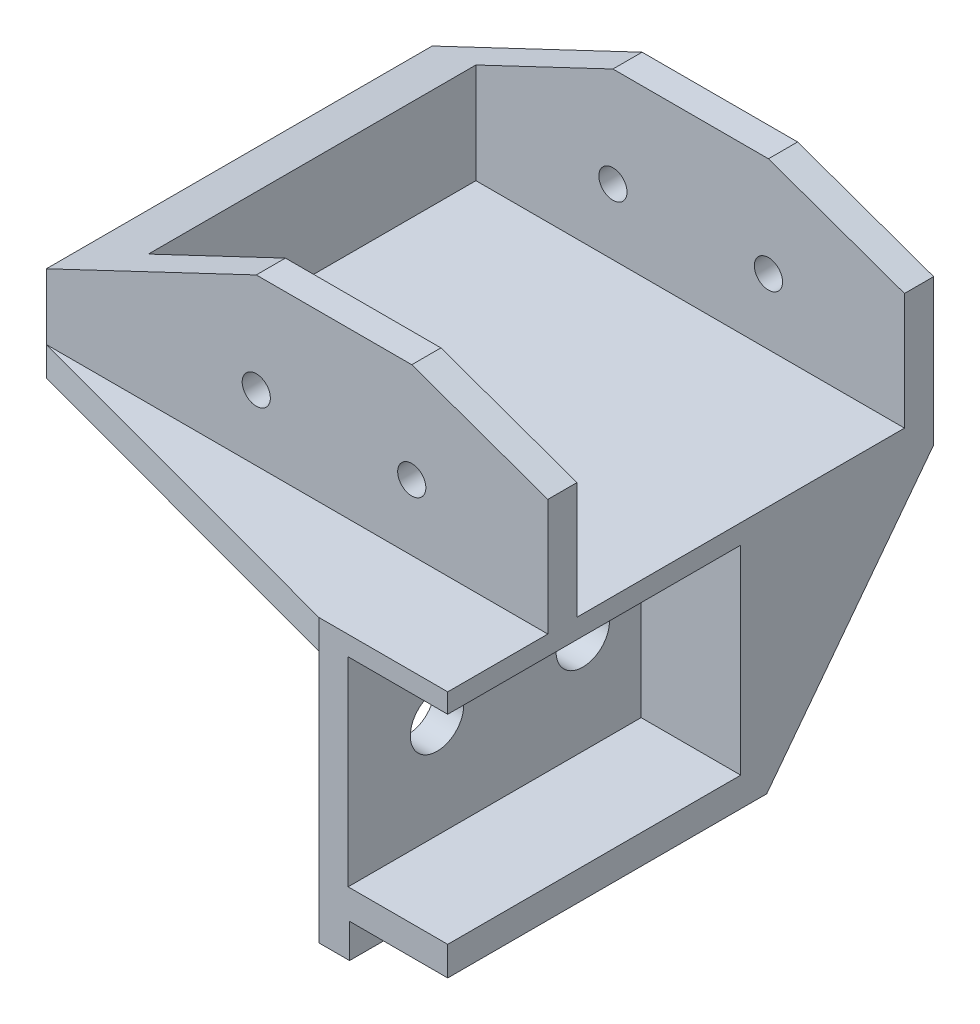
ISO-10303-21;
HEADER;
FILE_DESCRIPTION(('STEP AP214'),'2;1');
FILE_NAME('part.step','',(''),(''),'','','');
FILE_SCHEMA(('AUTOMOTIVE_DESIGN { 1 0 10303 214 1 1 1 1 }'));
ENDSEC;
DATA;
#1=APPLICATION_CONTEXT('core data for automotive mechanical design processes');
#2=APPLICATION_PROTOCOL_DEFINITION('international standard','automotive_design',2000,#1);
#3=PRODUCT_CONTEXT('',#1,'mechanical');
#4=PRODUCT('Part','Part','',(#3));
#5=PRODUCT_RELATED_PRODUCT_CATEGORY('part','',(#4));
#6=PRODUCT_DEFINITION_FORMATION('','',#4);
#7=PRODUCT_DEFINITION_CONTEXT('part definition',#1,'design');
#8=PRODUCT_DEFINITION('design','',#6,#7);
#9=PRODUCT_DEFINITION_SHAPE('','',#8);
#10=(LENGTH_UNIT() NAMED_UNIT(*) SI_UNIT(.MILLI.,.METRE.));
#11=(NAMED_UNIT(*) PLANE_ANGLE_UNIT() SI_UNIT($,.RADIAN.));
#12=(NAMED_UNIT(*) SI_UNIT($,.STERADIAN.) SOLID_ANGLE_UNIT());
#13=UNCERTAINTY_MEASURE_WITH_UNIT(LENGTH_MEASURE(1.E-05),#10,'distance_accuracy_value','');
#14=(GEOMETRIC_REPRESENTATION_CONTEXT(3) GLOBAL_UNCERTAINTY_ASSIGNED_CONTEXT((#13)) GLOBAL_UNIT_ASSIGNED_CONTEXT((#10,
#11,#12)) REPRESENTATION_CONTEXT('',''));
#15=CARTESIAN_POINT('',(0.,0.,0.));
#16=DIRECTION('',(0.,0.,1.));
#17=DIRECTION('',(1.,0.,0.));
#18=AXIS2_PLACEMENT_3D('',#15,#16,#17);
#19=CARTESIAN_POINT('',(0.,0.,39.7));
#20=DIRECTION('',(0.,0.,-1.));
#21=DIRECTION('',(-1.,0.,0.));
#22=AXIS2_PLACEMENT_3D('',#19,#20,#21);
#23=PLANE('',#22);
#24=CARTESIAN_POINT('',(-81.6,9.74999999999999,39.7));
#25=DIRECTION('',(0.,0.,-1.));
#26=DIRECTION('',(-1.,0.,0.));
#27=AXIS2_PLACEMENT_3D('',#24,#25,#26);
#28=CIRCLE('',#27,1.44999999999999);
#29=CARTESIAN_POINT('',(-83.05,9.74999999999999,39.7));
#30=VERTEX_POINT('',#29);
#31=EDGE_CURVE('E451',#30,#30,#28,.T.);
#32=ORIENTED_EDGE('',*,*,#31,.T.);
#33=EDGE_LOOP('',(#32));
#34=FACE_BOUND('',#33,.T.);
#35=CARTESIAN_POINT('',(-65.6,9.74999999999999,39.7));
#36=DIRECTION('',(0.,0.,-1.));
#37=DIRECTION('',(-1.,0.,0.));
#38=AXIS2_PLACEMENT_3D('',#35,#36,#37);
#39=CIRCLE('',#38,1.44999999999999);
#40=CARTESIAN_POINT('',(-67.05,9.74999999999999,39.7));
#41=VERTEX_POINT('',#40);
#42=EDGE_CURVE('E437',#41,#41,#39,.T.);
#43=ORIENTED_EDGE('',*,*,#42,.T.);
#44=EDGE_LOOP('',(#43));
#45=FACE_BOUND('',#44,.T.);
#46=DIRECTION('',(-1.,0.,0.));
#47=VECTOR('',#46,1.);
#48=CARTESIAN_POINT('',(0.,3.,39.7));
#49=LINE('',#48,#47);
#50=CARTESIAN_POINT('',(-51.6,2.99999999999999,39.7));
#51=VERTEX_POINT('',#50);
#52=CARTESIAN_POINT('',(-103.2,3.,39.7));
#53=VERTEX_POINT('',#52);
#54=EDGE_CURVE('E301',#51,#53,#49,.T.);
#55=ORIENTED_EDGE('',*,*,#54,.F.);
#56=DIRECTION('',(0.,1.,0.));
#57=VECTOR('',#56,1.);
#58=CARTESIAN_POINT('',(-51.6,0.,39.7));
#59=LINE('',#58,#57);
#60=CARTESIAN_POINT('',(-51.6,15.,39.7));
#61=VERTEX_POINT('',#60);
#62=EDGE_CURVE('E517',#51,#61,#59,.T.);
#63=ORIENTED_EDGE('',*,*,#62,.T.);
#64=DIRECTION('',(0.941741911594838,-0.336336396998156,0.));
#65=VECTOR('',#64,1.);
#66=CARTESIAN_POINT('',(-1.08597285067873,-3.04072398190046,39.7));
#67=LINE('',#66,#65);
#68=CARTESIAN_POINT('',(-65.6,20.,39.7));
#69=VERTEX_POINT('',#68);
#70=EDGE_CURVE('E405',#69,#61,#67,.T.);
#71=ORIENTED_EDGE('',*,*,#70,.F.);
#72=DIRECTION('',(-1.,0.,0.));
#73=VECTOR('',#72,1.);
#74=CARTESIAN_POINT('',(-103.2,20.,39.7));
#75=LINE('',#74,#73);
#76=CARTESIAN_POINT('',(-81.6,20.,39.7));
#77=VERTEX_POINT('',#76);
#78=EDGE_CURVE('E335',#69,#77,#75,.T.);
#79=ORIENTED_EDGE('',*,*,#78,.T.);
#80=DIRECTION('',(0.903439539264527,0.428715522104694,0.));
#81=VECTOR('',#80,1.);
#82=CARTESIAN_POINT('',(-22.7442061850259,47.9292540094205,39.7));
#83=LINE('',#82,#81);
#84=CARTESIAN_POINT('',(-103.2,9.75000000000001,39.7));
#85=VERTEX_POINT('',#84);
#86=EDGE_CURVE('E375',#85,#77,#83,.T.);
#87=ORIENTED_EDGE('',*,*,#86,.F.);
#88=DIRECTION('',(0.,-1.,0.));
#89=VECTOR('',#88,1.);
#90=CARTESIAN_POINT('',(-103.2,0.,39.7));
#91=LINE('',#90,#89);
#92=EDGE_CURVE('E339',#85,#53,#91,.T.);
#93=ORIENTED_EDGE('',*,*,#92,.T.);
#94=EDGE_LOOP('',(#55,#63,#71,#79,#87,#93));
#95=FACE_BOUND('',#94,.T.);
#96=ADVANCED_FACE('F47',(#34,#45,#95),#23,.F.);
#97=CARTESIAN_POINT('',(-103.2,20.,39.7));
#98=DIRECTION('',(0.,-1.,0.));
#99=DIRECTION('',(1.,0.,0.));
#100=AXIS2_PLACEMENT_3D('',#97,#98,#99);
#101=PLANE('',#100);
#102=DIRECTION('',(0.,0.,-1.));
#103=VECTOR('',#102,1.);
#104=CARTESIAN_POINT('',(-81.6,20.,50.));
#105=LINE('',#104,#103);
#106=CARTESIAN_POINT('',(-81.6,20.,36.7));
#107=VERTEX_POINT('',#106);
#108=EDGE_CURVE('E70',#77,#107,#105,.T.);
#109=ORIENTED_EDGE('',*,*,#108,.F.);
#110=ORIENTED_EDGE('',*,*,#78,.F.);
#111=DIRECTION('',(0.,0.,-1.));
#112=VECTOR('',#111,1.);
#113=CARTESIAN_POINT('',(-65.6,20.,50.));
#114=LINE('',#113,#112);
#115=CARTESIAN_POINT('',(-65.6,20.,36.7));
#116=VERTEX_POINT('',#115);
#117=EDGE_CURVE('E383',#69,#116,#114,.T.);
#118=ORIENTED_EDGE('',*,*,#117,.T.);
#119=DIRECTION('',(1.,0.,0.));
#120=VECTOR('',#119,1.);
#121=CARTESIAN_POINT('',(-95.7,20.,36.7));
#122=LINE('',#121,#120);
#123=EDGE_CURVE('E308',#107,#116,#122,.T.);
#124=ORIENTED_EDGE('',*,*,#123,.F.);
#125=EDGE_LOOP('',(#109,#110,#118,#124));
#126=FACE_BOUND('',#125,.T.);
#127=ADVANCED_FACE('F49',(#126),#101,.F.);
#128=CARTESIAN_POINT('',(-81.6,20.,3.));
#129=VERTEX_POINT('',#128);
#130=CARTESIAN_POINT('',(-81.6,20.,0.));
#131=VERTEX_POINT('',#130);
#132=EDGE_CURVE('E526',#129,#131,#105,.T.);
#133=ORIENTED_EDGE('',*,*,#132,.F.);
#134=DIRECTION('',(-1.,0.,0.));
#135=VECTOR('',#134,1.);
#136=CARTESIAN_POINT('',(-95.7,20.,3.));
#137=LINE('',#136,#135);
#138=CARTESIAN_POINT('',(-65.6000000000001,20.,3.));
#139=VERTEX_POINT('',#138);
#140=EDGE_CURVE('E321',#139,#129,#137,.T.);
#141=ORIENTED_EDGE('',*,*,#140,.F.);
#142=CARTESIAN_POINT('',(-65.6,20.,0.));
#143=VERTEX_POINT('',#142);
#144=EDGE_CURVE('E63',#139,#143,#114,.T.);
#145=ORIENTED_EDGE('',*,*,#144,.T.);
#146=DIRECTION('',(-1.,0.,0.));
#147=VECTOR('',#146,1.);
#148=CARTESIAN_POINT('',(-103.2,20.,0.));
#149=LINE('',#148,#147);
#150=EDGE_CURVE('E334',#143,#131,#149,.T.);
#151=ORIENTED_EDGE('',*,*,#150,.T.);
#152=EDGE_LOOP('',(#133,#141,#145,#151));
#153=FACE_BOUND('',#152,.T.);
#154=ADVANCED_FACE('F547',(#153),#101,.F.);
#155=CARTESIAN_POINT('',(-103.2,0.,39.7));
#156=DIRECTION('',(1.,0.,0.));
#157=DIRECTION('',(0.,0.,-1.));
#158=AXIS2_PLACEMENT_3D('',#155,#156,#157);
#159=PLANE('',#158);
#160=DIRECTION('',(0.,0.,-1.));
#161=VECTOR('',#160,1.);
#162=CARTESIAN_POINT('',(-103.2,9.75000000000001,50.));
#163=LINE('',#162,#161);
#164=CARTESIAN_POINT('',(-103.2,9.75000000000001,0.));
#165=VERTEX_POINT('',#164);
#166=EDGE_CURVE('E525',#85,#165,#163,.T.);
#167=ORIENTED_EDGE('',*,*,#166,.T.);
#168=DIRECTION('',(0.,-1.,0.));
#169=VECTOR('',#168,1.);
#170=CARTESIAN_POINT('',(-103.2,0.,0.));
#171=LINE('',#170,#169);
#172=CARTESIAN_POINT('',(-103.2,0.,0.));
#173=VERTEX_POINT('',#172);
#174=EDGE_CURVE('E348',#165,#173,#171,.T.);
#175=ORIENTED_EDGE('',*,*,#174,.T.);
#176=DIRECTION('',(0.,0.,-1.));
#177=VECTOR('',#176,1.);
#178=CARTESIAN_POINT('',(-103.2,0.,39.7));
#179=LINE('',#178,#177);
#180=CARTESIAN_POINT('',(-103.2,0.,39.7));
#181=VERTEX_POINT('',#180);
#182=EDGE_CURVE('E344',#181,#173,#179,.T.);
#183=ORIENTED_EDGE('',*,*,#182,.F.);
#184=DIRECTION('',(0.,-1.,0.));
#185=VECTOR('',#184,1.);
#186=CARTESIAN_POINT('',(-103.2,42.709098453629,39.7));
#187=LINE('',#186,#185);
#188=EDGE_CURVE('E459',#53,#181,#187,.T.);
#189=ORIENTED_EDGE('',*,*,#188,.F.);
#190=ORIENTED_EDGE('',*,*,#92,.F.);
#191=EDGE_LOOP('',(#167,#175,#183,#189,#190));
#192=FACE_BOUND('',#191,.T.);
#193=ADVANCED_FACE('F549',(#192),#159,.F.);
#194=CARTESIAN_POINT('',(0.,0.,0.));
#195=DIRECTION('',(0.,0.,-1.));
#196=DIRECTION('',(-1.,0.,0.));
#197=AXIS2_PLACEMENT_3D('',#194,#195,#196);
#198=PLANE('',#197);
#199=DIRECTION('',(0.,-1.,0.));
#200=VECTOR('',#199,1.);
#201=CARTESIAN_POINT('',(-51.6,20.,0.));
#202=LINE('',#201,#200);
#203=CARTESIAN_POINT('',(-51.6,15.,0.));
#204=VERTEX_POINT('',#203);
#205=CARTESIAN_POINT('',(-51.6,0.,0.));
#206=VERTEX_POINT('',#205);
#207=EDGE_CURVE('E202',#204,#206,#202,.T.);
#208=ORIENTED_EDGE('',*,*,#207,.T.);
#209=DIRECTION('',(1.,0.,0.));
#210=VECTOR('',#209,1.);
#211=CARTESIAN_POINT('',(-103.2,0.,0.));
#212=LINE('',#211,#210);
#213=CARTESIAN_POINT('',(-64.85,0.,0.));
#214=VERTEX_POINT('',#213);
#215=EDGE_CURVE('E218',#214,#206,#212,.T.);
#216=ORIENTED_EDGE('',*,*,#215,.F.);
#217=DIRECTION('',(1.,0.,0.));
#218=VECTOR('',#217,1.);
#219=CARTESIAN_POINT('',(0.,0.,0.));
#220=LINE('',#219,#218);
#221=EDGE_CURVE('E340',#173,#214,#220,.T.);
#222=ORIENTED_EDGE('',*,*,#221,.F.);
#223=ORIENTED_EDGE('',*,*,#174,.F.);
#224=DIRECTION('',(0.903439539264527,0.428715522104694,0.));
#225=VECTOR('',#224,1.);
#226=CARTESIAN_POINT('',(-22.7442061850259,47.9292540094205,0.));
#227=LINE('',#226,#225);
#228=EDGE_CURVE('E521',#165,#131,#227,.T.);
#229=ORIENTED_EDGE('',*,*,#228,.T.);
#230=ORIENTED_EDGE('',*,*,#150,.F.);
#231=DIRECTION('',(0.941741911594838,-0.336336396998156,0.));
#232=VECTOR('',#231,1.);
#233=CARTESIAN_POINT('',(-65.6,20.,0.));
#234=LINE('',#233,#232);
#235=EDGE_CURVE('E221',#143,#204,#234,.T.);
#236=ORIENTED_EDGE('',*,*,#235,.T.);
#237=EDGE_LOOP('',(#208,#216,#222,#223,#229,#230,#236));
#238=FACE_BOUND('',#237,.T.);
#239=CARTESIAN_POINT('',(-65.6,9.74999999999999,0.));
#240=DIRECTION('',(0.,0.,-1.));
#241=DIRECTION('',(-1.,0.,0.));
#242=AXIS2_PLACEMENT_3D('',#239,#240,#241);
#243=CIRCLE('',#242,1.475);
#244=CARTESIAN_POINT('',(-67.075,9.74999999999999,0.));
#245=VERTEX_POINT('',#244);
#246=EDGE_CURVE('E427',#245,#245,#243,.T.);
#247=ORIENTED_EDGE('',*,*,#246,.F.);
#248=EDGE_LOOP('',(#247));
#249=FACE_BOUND('',#248,.T.);
#250=CARTESIAN_POINT('',(-81.6,9.74999999999999,0.));
#251=DIRECTION('',(0.,0.,-1.));
#252=DIRECTION('',(-1.,0.,0.));
#253=AXIS2_PLACEMENT_3D('',#250,#251,#252);
#254=CIRCLE('',#253,1.475);
#255=CARTESIAN_POINT('',(-83.075,9.74999999999999,0.));
#256=VERTEX_POINT('',#255);
#257=EDGE_CURVE('E441',#256,#256,#254,.T.);
#258=ORIENTED_EDGE('',*,*,#257,.F.);
#259=EDGE_LOOP('',(#258));
#260=FACE_BOUND('',#259,.T.);
#261=ADVANCED_FACE('F215',(#238,#249,#260),#198,.T.);
#262=CARTESIAN_POINT('',(-95.7,-94.4189070049002,3.));
#263=DIRECTION('',(-1.,0.,0.));
#264=DIRECTION('',(0.,0.,1.));
#265=AXIS2_PLACEMENT_3D('',#262,#263,#264);
#266=PLANE('',#265);
#267=DIRECTION('',(0.,0.,-1.));
#268=VECTOR('',#267,1.);
#269=CARTESIAN_POINT('',(-95.7,13.3090277777778,3.));
#270=LINE('',#269,#268);
#271=CARTESIAN_POINT('',(-95.7,13.3090277777778,36.7));
#272=VERTEX_POINT('',#271);
#273=CARTESIAN_POINT('',(-95.7,13.3090277777778,3.));
#274=VERTEX_POINT('',#273);
#275=EDGE_CURVE('E398',#272,#274,#270,.T.);
#276=ORIENTED_EDGE('',*,*,#275,.F.);
#277=DIRECTION('',(0.,1.,0.));
#278=VECTOR('',#277,1.);
#279=CARTESIAN_POINT('',(-95.7,-94.4189070049002,36.7));
#280=LINE('',#279,#278);
#281=CARTESIAN_POINT('',(-95.7,2.99999999999999,36.7));
#282=VERTEX_POINT('',#281);
#283=EDGE_CURVE('E325',#282,#272,#280,.T.);
#284=ORIENTED_EDGE('',*,*,#283,.F.);
#285=DIRECTION('',(0.,0.,-1.));
#286=VECTOR('',#285,1.);
#287=CARTESIAN_POINT('',(-95.7,2.99999999999999,3.));
#288=LINE('',#287,#286);
#289=CARTESIAN_POINT('',(-95.7,2.99999999999999,3.));
#290=VERTEX_POINT('',#289);
#291=EDGE_CURVE('E313',#282,#290,#288,.T.);
#292=ORIENTED_EDGE('',*,*,#291,.T.);
#293=DIRECTION('',(0.,1.,0.));
#294=VECTOR('',#293,1.);
#295=CARTESIAN_POINT('',(-95.7,-94.4189070049002,3.));
#296=LINE('',#295,#294);
#297=EDGE_CURVE('E314',#290,#274,#296,.T.);
#298=ORIENTED_EDGE('',*,*,#297,.T.);
#299=EDGE_LOOP('',(#276,#284,#292,#298));
#300=FACE_BOUND('',#299,.T.);
#301=ADVANCED_FACE('F401',(#300),#266,.F.);
#302=CARTESIAN_POINT('',(-95.7,-94.4189070049002,3.));
#303=DIRECTION('',(0.,0.,-1.));
#304=DIRECTION('',(-1.,0.,0.));
#305=AXIS2_PLACEMENT_3D('',#302,#303,#304);
#306=PLANE('',#305);
#307=CARTESIAN_POINT('',(-81.6,9.74999999999999,3.));
#308=DIRECTION('',(0.,0.,-1.));
#309=DIRECTION('',(-1.,0.,0.));
#310=AXIS2_PLACEMENT_3D('',#307,#308,#309);
#311=CIRCLE('',#310,1.44999999999999);
#312=CARTESIAN_POINT('',(-83.05,9.74999999999999,3.));
#313=VERTEX_POINT('',#312);
#314=EDGE_CURVE('E359',#313,#313,#311,.T.);
#315=ORIENTED_EDGE('',*,*,#314,.T.);
#316=EDGE_LOOP('',(#315));
#317=FACE_BOUND('',#316,.T.);
#318=CARTESIAN_POINT('',(-65.6,9.74999999999999,3.));
#319=DIRECTION('',(0.,0.,-1.));
#320=DIRECTION('',(-1.,0.,0.));
#321=AXIS2_PLACEMENT_3D('',#318,#319,#320);
#322=CIRCLE('',#321,1.44999999999999);
#323=CARTESIAN_POINT('',(-67.05,9.74999999999999,3.));
#324=VERTEX_POINT('',#323);
#325=EDGE_CURVE('E365',#324,#324,#322,.T.);
#326=ORIENTED_EDGE('',*,*,#325,.T.);
#327=EDGE_LOOP('',(#326));
#328=FACE_BOUND('',#327,.T.);
#329=DIRECTION('',(1.,0.,0.));
#330=VECTOR('',#329,1.);
#331=CARTESIAN_POINT('',(-95.7,2.99999999999999,3.));
#332=LINE('',#331,#330);
#333=CARTESIAN_POINT('',(-51.6,2.99999999999999,3.));
#334=VERTEX_POINT('',#333);
#335=EDGE_CURVE('E309',#290,#334,#332,.T.);
#336=ORIENTED_EDGE('',*,*,#335,.T.);
#337=DIRECTION('',(0.,1.,0.));
#338=VECTOR('',#337,1.);
#339=CARTESIAN_POINT('',(-51.6,-94.4189070049002,3.));
#340=LINE('',#339,#338);
#341=CARTESIAN_POINT('',(-51.6,15.,3.));
#342=VERTEX_POINT('',#341);
#343=EDGE_CURVE('E544',#334,#342,#340,.T.);
#344=ORIENTED_EDGE('',*,*,#343,.T.);
#345=DIRECTION('',(0.941741911594838,-0.336336396998156,0.));
#346=VECTOR('',#345,1.);
#347=CARTESIAN_POINT('',(-56.0537398627013,16.5906213795362,3.));
#348=LINE('',#347,#346);
#349=EDGE_CURVE('E410',#139,#342,#348,.T.);
#350=ORIENTED_EDGE('',*,*,#349,.F.);
#351=ORIENTED_EDGE('',*,*,#140,.T.);
#352=DIRECTION('',(0.903439539264527,0.428715522104694,0.));
#353=VECTOR('',#352,1.);
#354=CARTESIAN_POINT('',(-137.425027900205,-6.4910433322731,3.00000000000001));
#355=LINE('',#354,#353);
#356=EDGE_CURVE('E404',#274,#129,#355,.T.);
#357=ORIENTED_EDGE('',*,*,#356,.F.);
#358=ORIENTED_EDGE('',*,*,#297,.F.);
#359=EDGE_LOOP('',(#336,#344,#350,#351,#357,#358));
#360=FACE_BOUND('',#359,.T.);
#361=ADVANCED_FACE('F543',(#317,#328,#360),#306,.F.);
#362=CARTESIAN_POINT('',(-95.7,-94.4189070049002,36.7));
#363=DIRECTION('',(0.,0.,1.));
#364=DIRECTION('',(1.,0.,0.));
#365=AXIS2_PLACEMENT_3D('',#362,#363,#364);
#366=PLANE('',#365);
#367=CARTESIAN_POINT('',(-81.6,9.74999999999999,36.7));
#368=DIRECTION('',(0.,0.,1.));
#369=DIRECTION('',(1.,0.,0.));
#370=AXIS2_PLACEMENT_3D('',#367,#368,#369);
#371=CIRCLE('',#370,1.44999999999999);
#372=CARTESIAN_POINT('',(-80.15,9.74999999999999,36.7));
#373=VERTEX_POINT('',#372);
#374=EDGE_CURVE('E363',#373,#373,#371,.T.);
#375=ORIENTED_EDGE('',*,*,#374,.T.);
#376=EDGE_LOOP('',(#375));
#377=FACE_BOUND('',#376,.T.);
#378=CARTESIAN_POINT('',(-65.6,9.74999999999999,36.7));
#379=DIRECTION('',(0.,0.,1.));
#380=DIRECTION('',(1.,0.,0.));
#381=AXIS2_PLACEMENT_3D('',#378,#379,#380);
#382=CIRCLE('',#381,1.44999999999999);
#383=CARTESIAN_POINT('',(-64.15,9.74999999999999,36.7));
#384=VERTEX_POINT('',#383);
#385=EDGE_CURVE('E369',#384,#384,#382,.T.);
#386=ORIENTED_EDGE('',*,*,#385,.T.);
#387=EDGE_LOOP('',(#386));
#388=FACE_BOUND('',#387,.T.);
#389=DIRECTION('',(-0.941741911594838,0.336336396998156,0.));
#390=VECTOR('',#389,1.);
#391=CARTESIAN_POINT('',(-56.0537398627013,16.5906213795362,36.7));
#392=LINE('',#391,#390);
#393=CARTESIAN_POINT('',(-51.6,15.,36.7));
#394=VERTEX_POINT('',#393);
#395=EDGE_CURVE('E56',#394,#116,#392,.T.);
#396=ORIENTED_EDGE('',*,*,#395,.F.);
#397=DIRECTION('',(0.,-1.,0.));
#398=VECTOR('',#397,1.);
#399=CARTESIAN_POINT('',(-51.6,-94.4189070049002,36.7));
#400=LINE('',#399,#398);
#401=CARTESIAN_POINT('',(-51.6,2.99999999999999,36.7));
#402=VERTEX_POINT('',#401);
#403=EDGE_CURVE('E210',#394,#402,#400,.T.);
#404=ORIENTED_EDGE('',*,*,#403,.T.);
#405=DIRECTION('',(-1.,0.,0.));
#406=VECTOR('',#405,1.);
#407=CARTESIAN_POINT('',(-95.7,2.99999999999999,36.7));
#408=LINE('',#407,#406);
#409=EDGE_CURVE('E317',#402,#282,#408,.T.);
#410=ORIENTED_EDGE('',*,*,#409,.T.);
#411=ORIENTED_EDGE('',*,*,#283,.T.);
#412=DIRECTION('',(-0.903439539264527,-0.428715522104694,0.));
#413=VECTOR('',#412,1.);
#414=CARTESIAN_POINT('',(-137.425027900205,-6.4910433322731,36.7));
#415=LINE('',#414,#413);
#416=EDGE_CURVE('E12',#107,#272,#415,.T.);
#417=ORIENTED_EDGE('',*,*,#416,.F.);
#418=ORIENTED_EDGE('',*,*,#123,.T.);
#419=EDGE_LOOP('',(#396,#404,#410,#411,#417,#418));
#420=FACE_BOUND('',#419,.T.);
#421=ADVANCED_FACE('F394',(#377,#388,#420),#366,.F.);
#422=CARTESIAN_POINT('',(0.,-26.,0.));
#423=DIRECTION('',(0.,-1.,0.));
#424=DIRECTION('',(1.,0.,0.));
#425=AXIS2_PLACEMENT_3D('',#422,#423,#424);
#426=PLANE('',#425);
#427=DIRECTION('',(1.,0.,0.));
#428=VECTOR('',#427,1.);
#429=CARTESIAN_POINT('',(-103.2,-26.,19.85));
#430=LINE('',#429,#428);
#431=CARTESIAN_POINT('',(-64.85,-26.,19.85));
#432=VERTEX_POINT('',#431);
#433=CARTESIAN_POINT('',(-61.7,-26.,19.85));
#434=VERTEX_POINT('',#433);
#435=EDGE_CURVE('E230',#432,#434,#430,.T.);
#436=ORIENTED_EDGE('',*,*,#435,.T.);
#437=DIRECTION('',(0.,0.,-1.));
#438=VECTOR('',#437,1.);
#439=CARTESIAN_POINT('',(-61.7,-26.,0.));
#440=LINE('',#439,#438);
#441=CARTESIAN_POINT('',(-61.7,-26.,50.));
#442=VERTEX_POINT('',#441);
#443=EDGE_CURVE('E244',#442,#434,#440,.T.);
#444=ORIENTED_EDGE('',*,*,#443,.F.);
#445=DIRECTION('',(-1.,0.,0.));
#446=VECTOR('',#445,1.);
#447=CARTESIAN_POINT('',(-64.85,-26.,50.));
#448=LINE('',#447,#446);
#449=CARTESIAN_POINT('',(-64.85,-26.,50.));
#450=VERTEX_POINT('',#449);
#451=EDGE_CURVE('E288',#442,#450,#448,.T.);
#452=ORIENTED_EDGE('',*,*,#451,.T.);
#453=DIRECTION('',(0.,0.,-1.));
#454=VECTOR('',#453,1.);
#455=CARTESIAN_POINT('',(-64.85,-26.,0.));
#456=LINE('',#455,#454);
#457=EDGE_CURVE('E291',#450,#432,#456,.T.);
#458=ORIENTED_EDGE('',*,*,#457,.T.);
#459=EDGE_LOOP('',(#436,#444,#452,#458));
#460=FACE_BOUND('',#459,.T.);
#461=ADVANCED_FACE('F487',(#460),#426,.T.);
#462=CARTESIAN_POINT('',(0.,0.,39.7));
#463=DIRECTION('',(0.,1.,0.));
#464=DIRECTION('',(-1.,0.,0.));
#465=AXIS2_PLACEMENT_3D('',#462,#463,#464);
#466=PLANE('',#465);
#467=DIRECTION('',(0.,0.,-1.));
#468=VECTOR('',#467,1.);
#469=CARTESIAN_POINT('',(-64.85,0.,39.7));
#470=LINE('',#469,#468);
#471=CARTESIAN_POINT('',(-64.85,0.,50.));
#472=VERTEX_POINT('',#471);
#473=EDGE_CURVE('E304',#472,#214,#470,.T.);
#474=ORIENTED_EDGE('',*,*,#473,.F.);
#475=DIRECTION('',(-0.965773626031422,0.,-0.259386397604267));
#476=VECTOR('',#475,1.);
#477=CARTESIAN_POINT('',(-64.85,0.,50.));
#478=LINE('',#477,#476);
#479=EDGE_CURVE('E237',#472,#181,#478,.T.);
#480=ORIENTED_EDGE('',*,*,#479,.T.);
#481=ORIENTED_EDGE('',*,*,#182,.T.);
#482=ORIENTED_EDGE('',*,*,#221,.T.);
#483=EDGE_LOOP('',(#474,#480,#481,#482));
#484=FACE_BOUND('',#483,.T.);
#485=ADVANCED_FACE('F475',(#484),#466,.F.);
#486=CARTESIAN_POINT('',(0.,3.,39.7));
#487=DIRECTION('',(0.,1.,0.));
#488=DIRECTION('',(-1.,0.,0.));
#489=AXIS2_PLACEMENT_3D('',#486,#487,#488);
#490=PLANE('',#489);
#491=DIRECTION('',(0.,0.,1.));
#492=VECTOR('',#491,1.);
#493=CARTESIAN_POINT('',(-51.6,2.99999999999999,39.7));
#494=LINE('',#493,#492);
#495=EDGE_CURVE('E861',#334,#402,#494,.T.);
#496=ORIENTED_EDGE('',*,*,#495,.F.);
#497=ORIENTED_EDGE('',*,*,#335,.F.);
#498=ORIENTED_EDGE('',*,*,#291,.F.);
#499=ORIENTED_EDGE('',*,*,#409,.F.);
#500=EDGE_LOOP('',(#496,#497,#498,#499));
#501=FACE_BOUND('',#500,.T.);
#502=ADVANCED_FACE('F564',(#501),#490,.T.);
#503=CARTESIAN_POINT('',(-64.85,-26.,0.));
#504=DIRECTION('',(1.,0.,0.));
#505=DIRECTION('',(0.,1.,0.));
#506=AXIS2_PLACEMENT_3D('',#503,#504,#505);
#507=PLANE('',#506);
#508=CARTESIAN_POINT('',(-64.85,-9.24999999999995,25.85));
#509=DIRECTION('',(1.,0.,0.));
#510=DIRECTION('',(0.,1.,0.));
#511=AXIS2_PLACEMENT_3D('',#508,#509,#510);
#512=CIRCLE('',#511,2.74999999999999);
#513=CARTESIAN_POINT('',(-64.85,-6.49999999999996,25.85));
#514=VERTEX_POINT('',#513);
#515=EDGE_CURVE('E374',#514,#514,#512,.T.);
#516=ORIENTED_EDGE('',*,*,#515,.T.);
#517=EDGE_LOOP('',(#516));
#518=FACE_BOUND('',#517,.T.);
#519=CARTESIAN_POINT('',(-64.85,-9.24999999999995,40.85));
#520=DIRECTION('',(1.,0.,0.));
#521=DIRECTION('',(0.,1.,0.));
#522=AXIS2_PLACEMENT_3D('',#519,#520,#521);
#523=CIRCLE('',#522,2.74999999999999);
#524=CARTESIAN_POINT('',(-64.85,-6.49999999999996,40.85));
#525=VERTEX_POINT('',#524);
#526=EDGE_CURVE('E419',#525,#525,#523,.T.);
#527=ORIENTED_EDGE('',*,*,#526,.T.);
#528=EDGE_LOOP('',(#527));
#529=FACE_BOUND('',#528,.T.);
#530=DIRECTION('',(0.,1.,0.));
#531=VECTOR('',#530,1.);
#532=CARTESIAN_POINT('',(-64.85,-26.,50.));
#533=LINE('',#532,#531);
#534=EDGE_CURVE('E295',#450,#472,#533,.T.);
#535=ORIENTED_EDGE('',*,*,#534,.T.);
#536=ORIENTED_EDGE('',*,*,#473,.T.);
#537=DIRECTION('',(0.,-0.794834835806078,0.606825826567332));
#538=VECTOR('',#537,1.);
#539=CARTESIAN_POINT('',(-64.85,-16.4258228214827,12.5404839617859));
#540=LINE('',#539,#538);
#541=EDGE_CURVE('E227',#214,#432,#540,.T.);
#542=ORIENTED_EDGE('',*,*,#541,.T.);
#543=ORIENTED_EDGE('',*,*,#457,.F.);
#544=EDGE_LOOP('',(#535,#536,#542,#543));
#545=FACE_BOUND('',#544,.T.);
#546=ADVANCED_FACE('F485',(#518,#529,#545),#507,.F.);
#547=CARTESIAN_POINT('',(0.,3.,0.));
#548=DIRECTION('',(0.,-1.,0.));
#549=DIRECTION('',(1.,0.,0.));
#550=AXIS2_PLACEMENT_3D('',#547,#548,#549);
#551=PLANE('',#550);
#552=DIRECTION('',(-1.,0.,0.));
#553=VECTOR('',#552,1.);
#554=CARTESIAN_POINT('',(-64.85,2.99999999999999,50.));
#555=LINE('',#554,#553);
#556=CARTESIAN_POINT('',(-51.6,3.,50.));
#557=VERTEX_POINT('',#556);
#558=CARTESIAN_POINT('',(-64.85,3.,50.));
#559=VERTEX_POINT('',#558);
#560=EDGE_CURVE('E287',#557,#559,#555,.T.);
#561=ORIENTED_EDGE('',*,*,#560,.F.);
#562=DIRECTION('',(0.,0.,-1.));
#563=VECTOR('',#562,1.);
#564=CARTESIAN_POINT('',(-51.6,2.99999999999999,0.));
#565=LINE('',#564,#563);
#566=EDGE_CURVE('E513',#557,#51,#565,.T.);
#567=ORIENTED_EDGE('',*,*,#566,.T.);
#568=ORIENTED_EDGE('',*,*,#54,.T.);
#569=DIRECTION('',(0.965773626031422,0.,0.259386397604267));
#570=VECTOR('',#569,1.);
#571=CARTESIAN_POINT('',(-64.85,3.,50.));
#572=LINE('',#571,#570);
#573=EDGE_CURVE('E455',#53,#559,#572,.T.);
#574=ORIENTED_EDGE('',*,*,#573,.T.);
#575=EDGE_LOOP('',(#561,#567,#568,#574));
#576=FACE_BOUND('',#575,.T.);
#577=ADVANCED_FACE('F554',(#576),#551,.F.);
#578=CARTESIAN_POINT('',(-64.85,-26.,50.));
#579=DIRECTION('',(0.,0.,-1.));
#580=DIRECTION('',(-1.,0.,0.));
#581=AXIS2_PLACEMENT_3D('',#578,#579,#580);
#582=PLANE('',#581);
#583=DIRECTION('',(1.,0.,0.));
#584=VECTOR('',#583,1.);
#585=CARTESIAN_POINT('',(-61.7,-22.5,50.));
#586=LINE('',#585,#584);
#587=CARTESIAN_POINT('',(-61.7,-22.5,50.));
#588=VERTEX_POINT('',#587);
#589=CARTESIAN_POINT('',(-51.6,-22.5,50.));
#590=VERTEX_POINT('',#589);
#591=EDGE_CURVE('E245',#588,#590,#586,.T.);
#592=ORIENTED_EDGE('',*,*,#591,.T.);
#593=DIRECTION('',(0.,1.,0.));
#594=VECTOR('',#593,1.);
#595=CARTESIAN_POINT('',(-51.6,20.,50.));
#596=LINE('',#595,#594);
#597=CARTESIAN_POINT('',(-51.6,-19.5,50.));
#598=VERTEX_POINT('',#597);
#599=EDGE_CURVE('E867',#590,#598,#596,.T.);
#600=ORIENTED_EDGE('',*,*,#599,.T.);
#601=DIRECTION('',(1.,0.,0.));
#602=VECTOR('',#601,1.);
#603=CARTESIAN_POINT('',(-61.85,-19.5,50.));
#604=LINE('',#603,#602);
#605=CARTESIAN_POINT('',(-61.85,-19.5,50.));
#606=VERTEX_POINT('',#605);
#607=EDGE_CURVE('E263',#606,#598,#604,.T.);
#608=ORIENTED_EDGE('',*,*,#607,.F.);
#609=DIRECTION('',(0.,-1.,0.));
#610=VECTOR('',#609,1.);
#611=CARTESIAN_POINT('',(-61.85,0.999999999999992,50.));
#612=LINE('',#611,#610);
#613=CARTESIAN_POINT('',(-61.85,0.99999999999999,50.));
#614=VERTEX_POINT('',#613);
#615=EDGE_CURVE('E253',#614,#606,#612,.T.);
#616=ORIENTED_EDGE('',*,*,#615,.F.);
#617=DIRECTION('',(-1.,0.,0.));
#618=VECTOR('',#617,1.);
#619=CARTESIAN_POINT('',(-61.85,0.999999999999992,50.));
#620=LINE('',#619,#618);
#621=CARTESIAN_POINT('',(-51.6,0.999999999999994,50.));
#622=VERTEX_POINT('',#621);
#623=EDGE_CURVE('E259',#622,#614,#620,.T.);
#624=ORIENTED_EDGE('',*,*,#623,.F.);
#625=EDGE_CURVE('E223',#622,#557,#596,.T.);
#626=ORIENTED_EDGE('',*,*,#625,.T.);
#627=ORIENTED_EDGE('',*,*,#560,.T.);
#628=DIRECTION('',(0.,-1.,0.));
#629=VECTOR('',#628,1.);
#630=CARTESIAN_POINT('',(-64.85,42.709098453629,50.));
#631=LINE('',#630,#629);
#632=EDGE_CURVE('E460',#559,#472,#631,.T.);
#633=ORIENTED_EDGE('',*,*,#632,.T.);
#634=ORIENTED_EDGE('',*,*,#534,.F.);
#635=ORIENTED_EDGE('',*,*,#451,.F.);
#636=DIRECTION('',(0.,-1.,0.));
#637=VECTOR('',#636,1.);
#638=CARTESIAN_POINT('',(-61.7,34.4262459290465,50.));
#639=LINE('',#638,#637);
#640=EDGE_CURVE('E250',#588,#442,#639,.T.);
#641=ORIENTED_EDGE('',*,*,#640,.F.);
#642=EDGE_LOOP('',(#592,#600,#608,#616,#624,#626,#627,#633,#634,#635,#641));
#643=FACE_BOUND('',#642,.T.);
#644=ADVANCED_FACE('F480',(#643),#582,.F.);
#645=CARTESIAN_POINT('',(0.,0.,19.85));
#646=DIRECTION('',(0.,0.,-1.));
#647=DIRECTION('',(-1.,0.,0.));
#648=AXIS2_PLACEMENT_3D('',#645,#646,#647);
#649=PLANE('',#648);
#650=DIRECTION('',(1.,0.,0.));
#651=VECTOR('',#650,1.);
#652=CARTESIAN_POINT('',(-61.85,-19.5,19.85));
#653=LINE('',#652,#651);
#654=CARTESIAN_POINT('',(-61.85,-19.5,19.85));
#655=VERTEX_POINT('',#654);
#656=CARTESIAN_POINT('',(-51.6,-19.5,19.85));
#657=VERTEX_POINT('',#656);
#658=EDGE_CURVE('E262',#655,#657,#653,.T.);
#659=ORIENTED_EDGE('',*,*,#658,.T.);
#660=DIRECTION('',(0.,1.,0.));
#661=VECTOR('',#660,1.);
#662=CARTESIAN_POINT('',(-51.6,0.,19.85));
#663=LINE('',#662,#661);
#664=CARTESIAN_POINT('',(-51.6,0.999999999999992,19.85));
#665=VERTEX_POINT('',#664);
#666=EDGE_CURVE('E502',#657,#665,#663,.T.);
#667=ORIENTED_EDGE('',*,*,#666,.T.);
#668=DIRECTION('',(-1.,0.,0.));
#669=VECTOR('',#668,1.);
#670=CARTESIAN_POINT('',(-61.85,0.999999999999992,19.85));
#671=LINE('',#670,#669);
#672=CARTESIAN_POINT('',(-61.85,0.999999999999992,19.85));
#673=VERTEX_POINT('',#672);
#674=EDGE_CURVE('E273',#665,#673,#671,.T.);
#675=ORIENTED_EDGE('',*,*,#674,.T.);
#676=DIRECTION('',(0.,-1.,0.));
#677=VECTOR('',#676,1.);
#678=CARTESIAN_POINT('',(-61.85,0.999999999999992,19.85));
#679=LINE('',#678,#677);
#680=EDGE_CURVE('E274',#673,#655,#679,.T.);
#681=ORIENTED_EDGE('',*,*,#680,.T.);
#682=EDGE_LOOP('',(#659,#667,#675,#681));
#683=FACE_BOUND('',#682,.T.);
#684=ADVANCED_FACE('F561',(#683),#649,.F.);
#685=CARTESIAN_POINT('',(-61.85,-19.5,-28.9913780286485));
#686=DIRECTION('',(0.,-1.,0.));
#687=DIRECTION('',(0.,0.,-1.));
#688=AXIS2_PLACEMENT_3D('',#685,#686,#687);
#689=PLANE('',#688);
#690=ORIENTED_EDGE('',*,*,#607,.T.);
#691=DIRECTION('',(0.,0.,-1.));
#692=VECTOR('',#691,1.);
#693=CARTESIAN_POINT('',(-51.6,-19.5,-28.9913780286485));
#694=LINE('',#693,#692);
#695=EDGE_CURVE('E509',#598,#657,#694,.T.);
#696=ORIENTED_EDGE('',*,*,#695,.T.);
#697=ORIENTED_EDGE('',*,*,#658,.F.);
#698=DIRECTION('',(0.,0.,1.));
#699=VECTOR('',#698,1.);
#700=CARTESIAN_POINT('',(-61.85,-19.5,-28.9913780286485));
#701=LINE('',#700,#699);
#702=EDGE_CURVE('E278',#655,#606,#701,.T.);
#703=ORIENTED_EDGE('',*,*,#702,.T.);
#704=EDGE_LOOP('',(#690,#696,#697,#703));
#705=FACE_BOUND('',#704,.T.);
#706=ADVANCED_FACE('F812',(#705),#689,.F.);
#707=CARTESIAN_POINT('',(-61.85,0.999999999999992,-28.9913780286485));
#708=DIRECTION('',(0.,1.,0.));
#709=DIRECTION('',(0.,0.,1.));
#710=AXIS2_PLACEMENT_3D('',#707,#708,#709);
#711=PLANE('',#710);
#712=ORIENTED_EDGE('',*,*,#674,.F.);
#713=DIRECTION('',(0.,0.,1.));
#714=VECTOR('',#713,1.);
#715=CARTESIAN_POINT('',(-51.6,0.999999999999992,-28.9913780286485));
#716=LINE('',#715,#714);
#717=EDGE_CURVE('E498',#665,#622,#716,.T.);
#718=ORIENTED_EDGE('',*,*,#717,.T.);
#719=ORIENTED_EDGE('',*,*,#623,.T.);
#720=DIRECTION('',(0.,0.,1.));
#721=VECTOR('',#720,1.);
#722=CARTESIAN_POINT('',(-61.85,0.999999999999992,-28.9913780286485));
#723=LINE('',#722,#721);
#724=EDGE_CURVE('E279',#673,#614,#723,.T.);
#725=ORIENTED_EDGE('',*,*,#724,.F.);
#726=EDGE_LOOP('',(#712,#718,#719,#725));
#727=FACE_BOUND('',#726,.T.);
#728=ADVANCED_FACE('F623',(#727),#711,.F.);
#729=CARTESIAN_POINT('',(-61.85,0.999999999999992,-28.9913780286485));
#730=DIRECTION('',(-1.,0.,0.));
#731=DIRECTION('',(0.,-1.,0.));
#732=AXIS2_PLACEMENT_3D('',#729,#730,#731);
#733=PLANE('',#732);
#734=CARTESIAN_POINT('',(-61.85,-9.24999999999995,25.85));
#735=DIRECTION('',(-1.,0.,0.));
#736=DIRECTION('',(0.,-1.,0.));
#737=AXIS2_PLACEMENT_3D('',#734,#735,#736);
#738=CIRCLE('',#737,2.74999999999999);
#739=CARTESIAN_POINT('',(-61.85,-11.9999999999999,25.85));
#740=VERTEX_POINT('',#739);
#741=EDGE_CURVE('E371',#740,#740,#738,.T.);
#742=ORIENTED_EDGE('',*,*,#741,.T.);
#743=EDGE_LOOP('',(#742));
#744=FACE_BOUND('',#743,.T.);
#745=CARTESIAN_POINT('',(-61.85,-9.24999999999995,40.85));
#746=DIRECTION('',(-1.,0.,0.));
#747=DIRECTION('',(0.,-1.,0.));
#748=AXIS2_PLACEMENT_3D('',#745,#746,#747);
#749=CIRCLE('',#748,2.74999999999999);
#750=CARTESIAN_POINT('',(-61.85,-11.9999999999999,40.85));
#751=VERTEX_POINT('',#750);
#752=EDGE_CURVE('E423',#751,#751,#749,.T.);
#753=ORIENTED_EDGE('',*,*,#752,.T.);
#754=EDGE_LOOP('',(#753));
#755=FACE_BOUND('',#754,.T.);
#756=ORIENTED_EDGE('',*,*,#724,.T.);
#757=ORIENTED_EDGE('',*,*,#615,.T.);
#758=ORIENTED_EDGE('',*,*,#702,.F.);
#759=ORIENTED_EDGE('',*,*,#680,.F.);
#760=EDGE_LOOP('',(#756,#757,#758,#759));
#761=FACE_BOUND('',#760,.T.);
#762=ADVANCED_FACE('F620',(#744,#755,#761),#733,.F.);
#763=CARTESIAN_POINT('',(-61.7,34.4262459290465,0.));
#764=DIRECTION('',(-1.,0.,0.));
#765=DIRECTION('',(0.,-1.,0.));
#766=AXIS2_PLACEMENT_3D('',#763,#764,#765);
#767=PLANE('',#766);
#768=ORIENTED_EDGE('',*,*,#443,.T.);
#769=DIRECTION('',(0.,0.794834835806078,-0.606825826567332));
#770=VECTOR('',#769,1.);
#771=CARTESIAN_POINT('',(-61.7,21.7492083092042,-16.6046840360655));
#772=LINE('',#771,#770);
#773=CARTESIAN_POINT('',(-61.7,-22.5,17.1778846153846));
#774=VERTEX_POINT('',#773);
#775=EDGE_CURVE('E229',#434,#774,#772,.T.);
#776=ORIENTED_EDGE('',*,*,#775,.T.);
#777=DIRECTION('',(0.,0.,1.));
#778=VECTOR('',#777,1.);
#779=CARTESIAN_POINT('',(-61.7,-22.5,0.));
#780=LINE('',#779,#778);
#781=EDGE_CURVE('E249',#774,#588,#780,.T.);
#782=ORIENTED_EDGE('',*,*,#781,.T.);
#783=ORIENTED_EDGE('',*,*,#640,.T.);
#784=EDGE_LOOP('',(#768,#776,#782,#783));
#785=FACE_BOUND('',#784,.T.);
#786=ADVANCED_FACE('F493',(#785),#767,.F.);
#787=CARTESIAN_POINT('',(-61.85,-22.5,-28.9913780286485));
#788=DIRECTION('',(0.,-1.,0.));
#789=DIRECTION('',(0.,0.,-1.));
#790=AXIS2_PLACEMENT_3D('',#787,#788,#789);
#791=PLANE('',#790);
#792=DIRECTION('',(0.,0.,-1.));
#793=VECTOR('',#792,1.);
#794=CARTESIAN_POINT('',(-51.6,-22.5,-28.9913780286485));
#795=LINE('',#794,#793);
#796=CARTESIAN_POINT('',(-51.6,-22.5,17.1778846153846));
#797=VERTEX_POINT('',#796);
#798=EDGE_CURVE('E205',#590,#797,#795,.T.);
#799=ORIENTED_EDGE('',*,*,#798,.F.);
#800=ORIENTED_EDGE('',*,*,#591,.F.);
#801=ORIENTED_EDGE('',*,*,#781,.F.);
#802=DIRECTION('',(-1.,0.,0.));
#803=VECTOR('',#802,1.);
#804=CARTESIAN_POINT('',(-61.85,-22.5,17.1778846153846));
#805=LINE('',#804,#803);
#806=EDGE_CURVE('E356',#797,#774,#805,.T.);
#807=ORIENTED_EDGE('',*,*,#806,.F.);
#808=EDGE_LOOP('',(#799,#800,#801,#807));
#809=FACE_BOUND('',#808,.T.);
#810=ADVANCED_FACE('F496',(#809),#791,.T.);
#811=CARTESIAN_POINT('',(-103.2,-26.,19.85));
#812=DIRECTION('',(0.,0.606825826567332,0.794834835806077));
#813=DIRECTION('',(0.,-0.794834835806077,0.606825826567332));
#814=AXIS2_PLACEMENT_3D('',#811,#812,#813);
#815=PLANE('',#814);
#816=ORIENTED_EDGE('',*,*,#215,.T.);
#817=DIRECTION('',(0.,-0.794834835806077,0.606825826567332));
#818=VECTOR('',#817,1.);
#819=CARTESIAN_POINT('',(-51.6,-26.,19.85));
#820=LINE('',#819,#818);
#821=EDGE_CURVE('E199',#206,#797,#820,.T.);
#822=ORIENTED_EDGE('',*,*,#821,.T.);
#823=ORIENTED_EDGE('',*,*,#806,.T.);
#824=ORIENTED_EDGE('',*,*,#775,.F.);
#825=ORIENTED_EDGE('',*,*,#435,.F.);
#826=ORIENTED_EDGE('',*,*,#541,.F.);
#827=EDGE_LOOP('',(#816,#822,#823,#824,#825,#826));
#828=FACE_BOUND('',#827,.T.);
#829=ADVANCED_FACE('F225',(#828),#815,.F.);
#830=CARTESIAN_POINT('',(-64.85,42.709098453629,50.));
#831=DIRECTION('',(-0.259386397604267,0.,0.965773626031422));
#832=DIRECTION('',(0.965773626031422,0.,0.259386397604267));
#833=AXIS2_PLACEMENT_3D('',#830,#831,#832);
#834=PLANE('',#833);
#835=ORIENTED_EDGE('',*,*,#573,.F.);
#836=ORIENTED_EDGE('',*,*,#188,.T.);
#837=ORIENTED_EDGE('',*,*,#479,.F.);
#838=ORIENTED_EDGE('',*,*,#632,.F.);
#839=EDGE_LOOP('',(#835,#836,#837,#838));
#840=FACE_BOUND('',#839,.T.);
#841=ADVANCED_FACE('F470',(#840),#834,.T.);
#842=CARTESIAN_POINT('',(-81.6,9.74999999999999,0.));
#843=DIRECTION('',(0.,0.,-1.));
#844=DIRECTION('',(-1.,0.,0.));
#845=AXIS2_PLACEMENT_3D('',#842,#843,#844);
#846=CYLINDRICAL_SURFACE('',#845,1.44999999999999);
#847=CARTESIAN_POINT('',(-81.6,9.74999999999999,0.0250000000000042));
#848=DIRECTION('',(0.,0.,-1.));
#849=DIRECTION('',(-1.,0.,0.));
#850=AXIS2_PLACEMENT_3D('',#847,#848,#849);
#851=CIRCLE('',#850,1.44999999999999);
#852=CARTESIAN_POINT('',(-83.05,9.74999999999999,0.0250000000000042));
#853=VERTEX_POINT('',#852);
#854=EDGE_CURVE('E364',#853,#853,#851,.T.);
#855=ORIENTED_EDGE('',*,*,#854,.T.);
#856=EDGE_LOOP('',(#855));
#857=FACE_BOUND('',#856,.T.);
#858=ORIENTED_EDGE('',*,*,#314,.F.);
#859=EDGE_LOOP('',(#858));
#860=FACE_BOUND('',#859,.T.);
#861=ADVANCED_FACE('F670',(#857,#860),#846,.F.);
#862=CARTESIAN_POINT('',(-81.6,9.74999999999999,0.));
#863=DIRECTION('',(0.,0.,-1.));
#864=DIRECTION('',(-1.,0.,0.));
#865=AXIS2_PLACEMENT_3D('',#862,#863,#864);
#866=CONICAL_SURFACE('',#865,1.475,0.785398163397587);
#867=ORIENTED_EDGE('',*,*,#854,.F.);
#868=EDGE_LOOP('',(#867));
#869=FACE_BOUND('',#868,.T.);
#870=ORIENTED_EDGE('',*,*,#257,.T.);
#871=EDGE_LOOP('',(#870));
#872=FACE_BOUND('',#871,.T.);
#873=ADVANCED_FACE('F667',(#869,#872),#866,.F.);
#874=ORIENTED_EDGE('',*,*,#374,.F.);
#875=EDGE_LOOP('',(#874));
#876=FACE_BOUND('',#875,.T.);
#877=ORIENTED_EDGE('',*,*,#31,.F.);
#878=EDGE_LOOP('',(#877));
#879=FACE_BOUND('',#878,.T.);
#880=ADVANCED_FACE('F659',(#876,#879),#846,.F.);
#881=CARTESIAN_POINT('',(-65.6,9.74999999999999,0.));
#882=DIRECTION('',(0.,0.,-1.));
#883=DIRECTION('',(-1.,0.,0.));
#884=AXIS2_PLACEMENT_3D('',#881,#882,#883);
#885=CYLINDRICAL_SURFACE('',#884,1.44999999999999);
#886=CARTESIAN_POINT('',(-65.6,9.74999999999999,0.0250000000000042));
#887=DIRECTION('',(0.,0.,-1.));
#888=DIRECTION('',(-1.,0.,0.));
#889=AXIS2_PLACEMENT_3D('',#886,#887,#888);
#890=CIRCLE('',#889,1.44999999999999);
#891=CARTESIAN_POINT('',(-67.05,9.74999999999999,0.0250000000000042));
#892=VERTEX_POINT('',#891);
#893=EDGE_CURVE('E370',#892,#892,#890,.T.);
#894=ORIENTED_EDGE('',*,*,#893,.T.);
#895=EDGE_LOOP('',(#894));
#896=FACE_BOUND('',#895,.T.);
#897=ORIENTED_EDGE('',*,*,#325,.F.);
#898=EDGE_LOOP('',(#897));
#899=FACE_BOUND('',#898,.T.);
#900=ADVANCED_FACE('F644',(#896,#899),#885,.F.);
#901=CARTESIAN_POINT('',(-65.6,9.74999999999999,0.));
#902=DIRECTION('',(0.,0.,-1.));
#903=DIRECTION('',(-1.,0.,0.));
#904=AXIS2_PLACEMENT_3D('',#901,#902,#903);
#905=CONICAL_SURFACE('',#904,1.475,0.785398163397587);
#906=ORIENTED_EDGE('',*,*,#893,.F.);
#907=EDGE_LOOP('',(#906));
#908=FACE_BOUND('',#907,.T.);
#909=ORIENTED_EDGE('',*,*,#246,.T.);
#910=EDGE_LOOP('',(#909));
#911=FACE_BOUND('',#910,.T.);
#912=ADVANCED_FACE('F641',(#908,#911),#905,.F.);
#913=ORIENTED_EDGE('',*,*,#385,.F.);
#914=EDGE_LOOP('',(#913));
#915=FACE_BOUND('',#914,.T.);
#916=ORIENTED_EDGE('',*,*,#42,.F.);
#917=EDGE_LOOP('',(#916));
#918=FACE_BOUND('',#917,.T.);
#919=ADVANCED_FACE('F613',(#915,#918),#885,.F.);
#920=CARTESIAN_POINT('',(-38.35,-9.24999999999995,40.85));
#921=DIRECTION('',(1.,0.,0.));
#922=DIRECTION('',(0.,0.,-1.));
#923=AXIS2_PLACEMENT_3D('',#920,#921,#922);
#924=CYLINDRICAL_SURFACE('',#923,2.74999999999999);
#925=ORIENTED_EDGE('',*,*,#526,.F.);
#926=EDGE_LOOP('',(#925));
#927=FACE_BOUND('',#926,.T.);
#928=ORIENTED_EDGE('',*,*,#752,.F.);
#929=EDGE_LOOP('',(#928));
#930=FACE_BOUND('',#929,.T.);
#931=ADVANCED_FACE('F603',(#927,#930),#924,.F.);
#932=CARTESIAN_POINT('',(-38.35,-9.24999999999995,25.85));
#933=DIRECTION('',(1.,0.,0.));
#934=DIRECTION('',(0.,0.,-1.));
#935=AXIS2_PLACEMENT_3D('',#932,#933,#934);
#936=CYLINDRICAL_SURFACE('',#935,2.74999999999999);
#937=ORIENTED_EDGE('',*,*,#741,.F.);
#938=EDGE_LOOP('',(#937));
#939=FACE_BOUND('',#938,.T.);
#940=ORIENTED_EDGE('',*,*,#515,.F.);
#941=EDGE_LOOP('',(#940));
#942=FACE_BOUND('',#941,.T.);
#943=ADVANCED_FACE('F599',(#939,#942),#936,.F.);
#944=CARTESIAN_POINT('',(-65.6,20.,50.));
#945=DIRECTION('',(0.336336396998156,0.941741911594837,0.));
#946=DIRECTION('',(-0.941741911594838,0.336336396998156,0.));
#947=AXIS2_PLACEMENT_3D('',#944,#945,#946);
#948=PLANE('',#947);
#949=ORIENTED_EDGE('',*,*,#70,.T.);
#950=DIRECTION('',(0.,0.,-1.));
#951=VECTOR('',#950,1.);
#952=CARTESIAN_POINT('',(-51.6,15.,50.));
#953=LINE('',#952,#951);
#954=EDGE_CURVE('E385',#61,#394,#953,.T.);
#955=ORIENTED_EDGE('',*,*,#954,.T.);
#956=ORIENTED_EDGE('',*,*,#395,.T.);
#957=ORIENTED_EDGE('',*,*,#117,.F.);
#958=EDGE_LOOP('',(#949,#955,#956,#957));
#959=FACE_BOUND('',#958,.T.);
#960=ADVANCED_FACE('F382',(#959),#948,.T.);
#961=CARTESIAN_POINT('',(-22.7442061850259,47.9292540094205,50.));
#962=DIRECTION('',(-0.428715522104694,0.903439539264527,0.));
#963=DIRECTION('',(-0.903439539264527,-0.428715522104694,0.));
#964=AXIS2_PLACEMENT_3D('',#961,#962,#963);
#965=PLANE('',#964);
#966=ORIENTED_EDGE('',*,*,#86,.T.);
#967=ORIENTED_EDGE('',*,*,#108,.T.);
#968=ORIENTED_EDGE('',*,*,#416,.T.);
#969=ORIENTED_EDGE('',*,*,#275,.T.);
#970=ORIENTED_EDGE('',*,*,#356,.T.);
#971=ORIENTED_EDGE('',*,*,#132,.T.);
#972=ORIENTED_EDGE('',*,*,#228,.F.);
#973=ORIENTED_EDGE('',*,*,#166,.F.);
#974=EDGE_LOOP('',(#966,#967,#968,#969,#970,#971,#972,#973));
#975=FACE_BOUND('',#974,.T.);
#976=ADVANCED_FACE('F397',(#975),#965,.T.);
#977=ORIENTED_EDGE('',*,*,#349,.T.);
#978=EDGE_CURVE('E392',#342,#204,#953,.T.);
#979=ORIENTED_EDGE('',*,*,#978,.T.);
#980=ORIENTED_EDGE('',*,*,#235,.F.);
#981=ORIENTED_EDGE('',*,*,#144,.F.);
#982=EDGE_LOOP('',(#977,#979,#980,#981));
#983=FACE_BOUND('',#982,.T.);
#984=ADVANCED_FACE('F539',(#983),#948,.T.);
#985=CARTESIAN_POINT('',(-51.6,0.,0.));
#986=DIRECTION('',(-1.,0.,0.));
#987=DIRECTION('',(0.,0.,1.));
#988=AXIS2_PLACEMENT_3D('',#985,#986,#987);
#989=PLANE('',#988);
#990=ORIENTED_EDGE('',*,*,#566,.F.);
#991=ORIENTED_EDGE('',*,*,#625,.F.);
#992=ORIENTED_EDGE('',*,*,#717,.F.);
#993=ORIENTED_EDGE('',*,*,#666,.F.);
#994=ORIENTED_EDGE('',*,*,#695,.F.);
#995=ORIENTED_EDGE('',*,*,#599,.F.);
#996=ORIENTED_EDGE('',*,*,#798,.T.);
#997=ORIENTED_EDGE('',*,*,#821,.F.);
#998=ORIENTED_EDGE('',*,*,#207,.F.);
#999=ORIENTED_EDGE('',*,*,#978,.F.);
#1000=ORIENTED_EDGE('',*,*,#343,.F.);
#1001=ORIENTED_EDGE('',*,*,#495,.T.);
#1002=ORIENTED_EDGE('',*,*,#403,.F.);
#1003=ORIENTED_EDGE('',*,*,#954,.F.);
#1004=ORIENTED_EDGE('',*,*,#62,.F.);
#1005=EDGE_LOOP('',(#990,#991,#992,#993,#994,#995,#996,#997,#998,#999,#1000,#1001,#1002,#1003,#1004));
#1006=FACE_BOUND('',#1005,.T.);
#1007=ADVANCED_FACE('F201',(#1006),#989,.F.);
#1008=CLOSED_SHELL('',(#96,#127,#154,#193,#261,#301,#361,#421,#461,#485,#502,#546,#577,#644,
#684,#706,#728,#762,#786,#810,#829,#841,#861,#873,#880,#900,#912,#919,#931,#943,#960,#976,#984,#1007));
#1009=MANIFOLD_SOLID_BREP('B2',#1008);
#1010=ADVANCED_BREP_SHAPE_REPRESENTATION('',(#18,#1009),#14);
#1011=SHAPE_DEFINITION_REPRESENTATION(#9,#1010);
ENDSEC;
END-ISO-10303-21;
